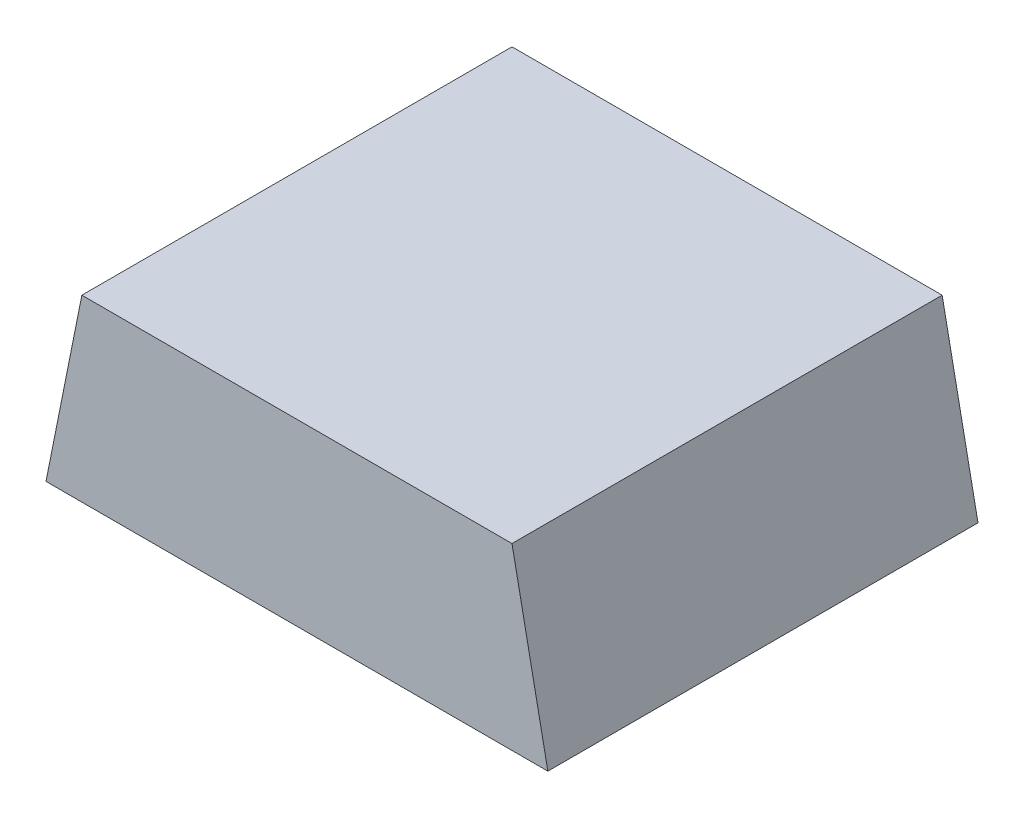
ISO-10303-21;
HEADER;
FILE_DESCRIPTION(('STEP AP214'),'2;1');
FILE_NAME('part.step','',(''),(''),'','','');
FILE_SCHEMA(('AUTOMOTIVE_DESIGN { 1 0 10303 214 1 1 1 1 }'));
ENDSEC;
DATA;
#1=APPLICATION_CONTEXT('core data for automotive mechanical design processes');
#2=APPLICATION_PROTOCOL_DEFINITION('international standard','automotive_design',2000,#1);
#3=PRODUCT_CONTEXT('',#1,'mechanical');
#4=PRODUCT('Part','Part','',(#3));
#5=PRODUCT_RELATED_PRODUCT_CATEGORY('part','',(#4));
#6=PRODUCT_DEFINITION_FORMATION('','',#4);
#7=PRODUCT_DEFINITION_CONTEXT('part definition',#1,'design');
#8=PRODUCT_DEFINITION('design','',#6,#7);
#9=PRODUCT_DEFINITION_SHAPE('','',#8);
#10=(LENGTH_UNIT() NAMED_UNIT(*) SI_UNIT(.MILLI.,.METRE.));
#11=(NAMED_UNIT(*) PLANE_ANGLE_UNIT() SI_UNIT($,.RADIAN.));
#12=(NAMED_UNIT(*) SI_UNIT($,.STERADIAN.) SOLID_ANGLE_UNIT());
#13=UNCERTAINTY_MEASURE_WITH_UNIT(LENGTH_MEASURE(1.E-05),#10,'distance_accuracy_value','');
#14=(GEOMETRIC_REPRESENTATION_CONTEXT(3) GLOBAL_UNCERTAINTY_ASSIGNED_CONTEXT((#13)) GLOBAL_UNIT_ASSIGNED_CONTEXT((#10,
#11,#12)) REPRESENTATION_CONTEXT('',''));
#15=CARTESIAN_POINT('',(0.,0.,0.));
#16=DIRECTION('',(0.,0.,1.));
#17=DIRECTION('',(1.,0.,0.));
#18=AXIS2_PLACEMENT_3D('',#15,#16,#17);
#19=CARTESIAN_POINT('',(-0.7,0.3,-0.6));
#20=DIRECTION('',(0.98058067569092,-0.196116135138184,0.));
#21=DIRECTION('',(0.196116135138184,0.98058067569092,0.));
#22=AXIS2_PLACEMENT_3D('',#19,#20,#21);
#23=PLANE('',#22);
#24=DIRECTION('',(0.,0.,-1.));
#25=VECTOR('',#24,1.);
#26=CARTESIAN_POINT('',(-0.7,0.3,0.));
#27=LINE('',#26,#25);
#28=CARTESIAN_POINT('',(-0.6999999998264,0.3,0.6));
#29=VERTEX_POINT('',#28);
#30=CARTESIAN_POINT('',(-0.6999999999132,0.3,-0.6));
#31=VERTEX_POINT('',#30);
#32=EDGE_CURVE('E26',#29,#31,#27,.T.);
#33=ORIENTED_EDGE('',*,*,#32,.F.);
#34=DIRECTION('',(-0.196116134281308,-0.980580675862296,0.));
#35=VECTOR('',#34,1.);
#36=CARTESIAN_POINT('',(-0.6000000001072,0.8,0.6));
#37=LINE('',#36,#35);
#38=CARTESIAN_POINT('',(-0.6000000000536,0.8,0.6));
#39=VERTEX_POINT('',#38);
#40=EDGE_CURVE('E35',#39,#29,#37,.T.);
#41=ORIENTED_EDGE('',*,*,#40,.F.);
#42=DIRECTION('',(0.,0.,1.));
#43=VECTOR('',#42,1.);
#44=CARTESIAN_POINT('',(-0.6,0.8,0.));
#45=LINE('',#44,#43);
#46=CARTESIAN_POINT('',(-0.6000000000268,0.8,-0.6));
#47=VERTEX_POINT('',#46);
#48=EDGE_CURVE('E64',#47,#39,#45,.T.);
#49=ORIENTED_EDGE('',*,*,#48,.F.);
#50=DIRECTION('',(0.196116135138184,0.98058067569092,0.));
#51=VECTOR('',#50,1.);
#52=CARTESIAN_POINT('',(-0.65,0.55,-0.6));
#53=LINE('',#52,#51);
#54=EDGE_CURVE('E10',#31,#47,#53,.T.);
#55=ORIENTED_EDGE('',*,*,#54,.F.);
#56=EDGE_LOOP('',(#33,#41,#49,#55));
#57=FACE_BOUND('',#56,.T.);
#58=ADVANCED_FACE('F16',(#57),#23,.F.);
#59=CARTESIAN_POINT('',(-0.7084,0.3,-0.6));
#60=DIRECTION('',(0.,0.,1.));
#61=DIRECTION('',(1.,0.,0.));
#62=AXIS2_PLACEMENT_3D('',#59,#60,#61);
#63=PLANE('',#62);
#64=DIRECTION('',(-1.,0.,0.));
#65=VECTOR('',#64,1.);
#66=CARTESIAN_POINT('',(0.,0.8,-0.6));
#67=LINE('',#66,#65);
#68=CARTESIAN_POINT('',(0.6,0.8,-0.6));
#69=VERTEX_POINT('',#68);
#70=EDGE_CURVE('E72',#69,#47,#67,.T.);
#71=ORIENTED_EDGE('',*,*,#70,.F.);
#72=DIRECTION('',(-0.196116135138184,0.98058067569092,0.));
#73=VECTOR('',#72,1.);
#74=CARTESIAN_POINT('',(0.6,0.8,-0.6));
#75=LINE('',#74,#73);
#76=CARTESIAN_POINT('',(0.7,0.3,-0.6));
#77=VERTEX_POINT('',#76);
#78=EDGE_CURVE('E70',#77,#69,#75,.T.);
#79=ORIENTED_EDGE('',*,*,#78,.F.);
#80=DIRECTION('',(1.,0.,0.));
#81=VECTOR('',#80,1.);
#82=CARTESIAN_POINT('',(0.,0.3,-0.6));
#83=LINE('',#82,#81);
#84=EDGE_CURVE('E78',#31,#77,#83,.T.);
#85=ORIENTED_EDGE('',*,*,#84,.F.);
#86=ORIENTED_EDGE('',*,*,#54,.T.);
#87=EDGE_LOOP('',(#71,#79,#85,#86));
#88=FACE_BOUND('',#87,.T.);
#89=ADVANCED_FACE('F85',(#88),#63,.F.);
#90=CARTESIAN_POINT('',(0.7,0.3,-0.6));
#91=DIRECTION('',(0.,1.,0.));
#92=DIRECTION('',(0.,0.,1.));
#93=AXIS2_PLACEMENT_3D('',#90,#91,#92);
#94=PLANE('',#93);
#95=DIRECTION('',(0.,0.,-1.));
#96=VECTOR('',#95,1.);
#97=CARTESIAN_POINT('',(0.7,0.3,0.));
#98=LINE('',#97,#96);
#99=CARTESIAN_POINT('',(0.6999999998264,0.3,0.6));
#100=VERTEX_POINT('',#99);
#101=EDGE_CURVE('E73',#100,#77,#98,.T.);
#102=ORIENTED_EDGE('',*,*,#101,.F.);
#103=DIRECTION('',(1.,0.,0.));
#104=VECTOR('',#103,1.);
#105=CARTESIAN_POINT('',(0.,0.3,0.6));
#106=LINE('',#105,#104);
#107=EDGE_CURVE('E53',#29,#100,#106,.T.);
#108=ORIENTED_EDGE('',*,*,#107,.F.);
#109=ORIENTED_EDGE('',*,*,#32,.T.);
#110=ORIENTED_EDGE('',*,*,#84,.T.);
#111=EDGE_LOOP('',(#102,#108,#109,#110));
#112=FACE_BOUND('',#111,.T.);
#113=ADVANCED_FACE('F90',(#112),#94,.F.);
#114=CARTESIAN_POINT('',(-0.6,0.8,-0.6));
#115=DIRECTION('',(0.,-1.,0.));
#116=DIRECTION('',(0.,0.,-1.));
#117=AXIS2_PLACEMENT_3D('',#114,#115,#116);
#118=PLANE('',#117);
#119=ORIENTED_EDGE('',*,*,#48,.T.);
#120=DIRECTION('',(-1.,0.,0.));
#121=VECTOR('',#120,1.);
#122=CARTESIAN_POINT('',(0.,0.8,0.6));
#123=LINE('',#122,#121);
#124=CARTESIAN_POINT('',(0.6000000000268,0.8,0.6));
#125=VERTEX_POINT('',#124);
#126=EDGE_CURVE('E59',#125,#39,#123,.T.);
#127=ORIENTED_EDGE('',*,*,#126,.F.);
#128=DIRECTION('',(0.,0.,1.));
#129=VECTOR('',#128,1.);
#130=CARTESIAN_POINT('',(0.6,0.8,0.));
#131=LINE('',#130,#129);
#132=EDGE_CURVE('E63',#69,#125,#131,.T.);
#133=ORIENTED_EDGE('',*,*,#132,.F.);
#134=ORIENTED_EDGE('',*,*,#70,.T.);
#135=EDGE_LOOP('',(#119,#127,#133,#134));
#136=FACE_BOUND('',#135,.T.);
#137=ADVANCED_FACE('F61',(#136),#118,.F.);
#138=CARTESIAN_POINT('',(0.6,0.8,-0.6));
#139=DIRECTION('',(-0.98058067569092,-0.196116135138184,0.));
#140=DIRECTION('',(0.196116135138184,-0.98058067569092,0.));
#141=AXIS2_PLACEMENT_3D('',#138,#139,#140);
#142=PLANE('',#141);
#143=ORIENTED_EDGE('',*,*,#132,.T.);
#144=DIRECTION('',(-0.196116135138184,0.98058067569092,0.));
#145=VECTOR('',#144,1.);
#146=CARTESIAN_POINT('',(0.65,0.55,0.6));
#147=LINE('',#146,#145);
#148=EDGE_CURVE('E20',#100,#125,#147,.T.);
#149=ORIENTED_EDGE('',*,*,#148,.F.);
#150=ORIENTED_EDGE('',*,*,#101,.T.);
#151=ORIENTED_EDGE('',*,*,#78,.T.);
#152=EDGE_LOOP('',(#143,#149,#150,#151));
#153=FACE_BOUND('',#152,.T.);
#154=ADVANCED_FACE('F68',(#153),#142,.F.);
#155=CARTESIAN_POINT('',(-0.7084,0.3,0.6));
#156=DIRECTION('',(0.,0.,1.));
#157=DIRECTION('',(1.,0.,0.));
#158=AXIS2_PLACEMENT_3D('',#155,#156,#157);
#159=PLANE('',#158);
#160=ORIENTED_EDGE('',*,*,#148,.T.);
#161=ORIENTED_EDGE('',*,*,#126,.T.);
#162=ORIENTED_EDGE('',*,*,#40,.T.);
#163=ORIENTED_EDGE('',*,*,#107,.T.);
#164=EDGE_LOOP('',(#160,#161,#162,#163));
#165=FACE_BOUND('',#164,.T.);
#166=ADVANCED_FACE('F18',(#165),#159,.T.);
#167=CLOSED_SHELL('',(#58,#89,#113,#137,#154,#166));
#168=MANIFOLD_SOLID_BREP('B1',#167);
#169=ADVANCED_BREP_SHAPE_REPRESENTATION('',(#18,#168),#14);
#170=SHAPE_DEFINITION_REPRESENTATION(#9,#169);
ENDSEC;
END-ISO-10303-21;
